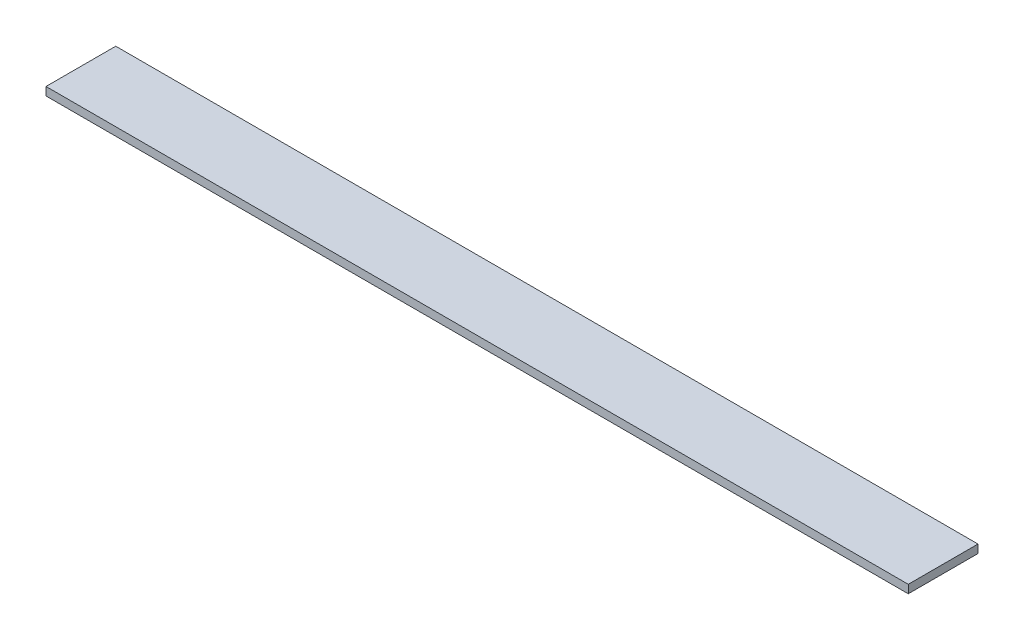
ISO-10303-21;
HEADER;
FILE_DESCRIPTION(('STEP AP214'),'2;1');
FILE_NAME('part.step','',(''),(''),'','','');
FILE_SCHEMA(('AUTOMOTIVE_DESIGN { 1 0 10303 214 1 1 1 1 }'));
ENDSEC;
DATA;
#1=APPLICATION_CONTEXT('core data for automotive mechanical design processes');
#2=APPLICATION_PROTOCOL_DEFINITION('international standard','automotive_design',2000,#1);
#3=PRODUCT_CONTEXT('',#1,'mechanical');
#4=PRODUCT('Part','Part','',(#3));
#5=PRODUCT_RELATED_PRODUCT_CATEGORY('part','',(#4));
#6=PRODUCT_DEFINITION_FORMATION('','',#4);
#7=PRODUCT_DEFINITION_CONTEXT('part definition',#1,'design');
#8=PRODUCT_DEFINITION('design','',#6,#7);
#9=PRODUCT_DEFINITION_SHAPE('','',#8);
#10=(LENGTH_UNIT() NAMED_UNIT(*) SI_UNIT(.MILLI.,.METRE.));
#11=(NAMED_UNIT(*) PLANE_ANGLE_UNIT() SI_UNIT($,.RADIAN.));
#12=(NAMED_UNIT(*) SI_UNIT($,.STERADIAN.) SOLID_ANGLE_UNIT());
#13=UNCERTAINTY_MEASURE_WITH_UNIT(LENGTH_MEASURE(1.E-05),#10,'distance_accuracy_value','');
#14=(GEOMETRIC_REPRESENTATION_CONTEXT(3) GLOBAL_UNCERTAINTY_ASSIGNED_CONTEXT((#13)) GLOBAL_UNIT_ASSIGNED_CONTEXT((#10,
#11,#12)) REPRESENTATION_CONTEXT('',''));
#15=CARTESIAN_POINT('',(0.,0.,0.));
#16=DIRECTION('',(0.,0.,1.));
#17=DIRECTION('',(1.,0.,0.));
#18=AXIS2_PLACEMENT_3D('',#15,#16,#17);
#19=CARTESIAN_POINT('',(-15.625,1.3,-7.5));
#20=DIRECTION('',(1.,0.,0.));
#21=DIRECTION('',(0.,0.,-1.));
#22=AXIS2_PLACEMENT_3D('',#19,#20,#21);
#23=PLANE('',#22);
#24=DIRECTION('',(0.,0.,1.));
#25=VECTOR('',#24,1.);
#26=CARTESIAN_POINT('',(-15.625,0.,-7.5));
#27=LINE('',#26,#25);
#28=CARTESIAN_POINT('',(-15.625,0.,-7.5));
#29=VERTEX_POINT('',#28);
#30=CARTESIAN_POINT('',(-15.625,0.,3.5));
#31=VERTEX_POINT('',#30);
#32=EDGE_CURVE('E93',#29,#31,#27,.T.);
#33=ORIENTED_EDGE('',*,*,#32,.T.);
#34=DIRECTION('',(0.,-1.,0.));
#35=VECTOR('',#34,1.);
#36=CARTESIAN_POINT('',(-15.625,1.3,3.5));
#37=LINE('',#36,#35);
#38=CARTESIAN_POINT('',(-15.625,1.3,3.5));
#39=VERTEX_POINT('',#38);
#40=EDGE_CURVE('E11',#39,#31,#37,.T.);
#41=ORIENTED_EDGE('',*,*,#40,.F.);
#42=DIRECTION('',(0.,0.,1.));
#43=VECTOR('',#42,1.);
#44=CARTESIAN_POINT('',(-15.625,1.3,-7.5));
#45=LINE('',#44,#43);
#46=CARTESIAN_POINT('',(-15.625,1.3,-7.5));
#47=VERTEX_POINT('',#46);
#48=EDGE_CURVE('E113',#47,#39,#45,.T.);
#49=ORIENTED_EDGE('',*,*,#48,.F.);
#50=DIRECTION('',(0.,-1.,0.));
#51=VECTOR('',#50,1.);
#52=CARTESIAN_POINT('',(-15.625,1.3,-7.5));
#53=LINE('',#52,#51);
#54=EDGE_CURVE('E52',#47,#29,#53,.T.);
#55=ORIENTED_EDGE('',*,*,#54,.T.);
#56=EDGE_LOOP('',(#33,#41,#49,#55));
#57=FACE_BOUND('',#56,.T.);
#58=ADVANCED_FACE('F43',(#57),#23,.F.);
#59=CARTESIAN_POINT('',(-15.625,1.3,3.5));
#60=DIRECTION('',(0.,0.,-1.));
#61=DIRECTION('',(-1.,0.,0.));
#62=AXIS2_PLACEMENT_3D('',#59,#60,#61);
#63=PLANE('',#62);
#64=DIRECTION('',(1.,0.,0.));
#65=VECTOR('',#64,1.);
#66=CARTESIAN_POINT('',(-15.625,0.,3.5));
#67=LINE('',#66,#65);
#68=CARTESIAN_POINT('',(120.375,0.,3.5));
#69=VERTEX_POINT('',#68);
#70=EDGE_CURVE('E72',#31,#69,#67,.T.);
#71=ORIENTED_EDGE('',*,*,#70,.T.);
#72=DIRECTION('',(0.,-1.,0.));
#73=VECTOR('',#72,1.);
#74=CARTESIAN_POINT('',(120.375,1.3,3.5));
#75=LINE('',#74,#73);
#76=CARTESIAN_POINT('',(120.375,1.3,3.5));
#77=VERTEX_POINT('',#76);
#78=EDGE_CURVE('E88',#77,#69,#75,.T.);
#79=ORIENTED_EDGE('',*,*,#78,.F.);
#80=DIRECTION('',(1.,0.,0.));
#81=VECTOR('',#80,1.);
#82=CARTESIAN_POINT('',(-15.625,1.3,3.5));
#83=LINE('',#82,#81);
#84=EDGE_CURVE('E76',#39,#77,#83,.T.);
#85=ORIENTED_EDGE('',*,*,#84,.F.);
#86=ORIENTED_EDGE('',*,*,#40,.T.);
#87=EDGE_LOOP('',(#71,#79,#85,#86));
#88=FACE_BOUND('',#87,.T.);
#89=ADVANCED_FACE('F86',(#88),#63,.F.);
#90=CARTESIAN_POINT('',(-15.625,1.3,-7.5));
#91=DIRECTION('',(0.,0.,1.));
#92=DIRECTION('',(1.,0.,0.));
#93=AXIS2_PLACEMENT_3D('',#90,#91,#92);
#94=PLANE('',#93);
#95=DIRECTION('',(-1.,0.,0.));
#96=VECTOR('',#95,1.);
#97=CARTESIAN_POINT('',(-15.625,0.,-7.5));
#98=LINE('',#97,#96);
#99=CARTESIAN_POINT('',(120.375,0.,-7.5));
#100=VERTEX_POINT('',#99);
#101=EDGE_CURVE('E92',#100,#29,#98,.T.);
#102=ORIENTED_EDGE('',*,*,#101,.T.);
#103=ORIENTED_EDGE('',*,*,#54,.F.);
#104=DIRECTION('',(-1.,0.,0.));
#105=VECTOR('',#104,1.);
#106=CARTESIAN_POINT('',(-15.625,1.3,-7.5));
#107=LINE('',#106,#105);
#108=CARTESIAN_POINT('',(120.375,1.3,-7.5));
#109=VERTEX_POINT('',#108);
#110=EDGE_CURVE('E60',#109,#47,#107,.T.);
#111=ORIENTED_EDGE('',*,*,#110,.F.);
#112=DIRECTION('',(0.,1.,0.));
#113=VECTOR('',#112,1.);
#114=CARTESIAN_POINT('',(120.375,1.3,-7.5));
#115=LINE('',#114,#113);
#116=EDGE_CURVE('E102',#100,#109,#115,.T.);
#117=ORIENTED_EDGE('',*,*,#116,.F.);
#118=EDGE_LOOP('',(#102,#103,#111,#117));
#119=FACE_BOUND('',#118,.T.);
#120=ADVANCED_FACE('F128',(#119),#94,.F.);
#121=CARTESIAN_POINT('',(0.,1.3,0.));
#122=DIRECTION('',(0.,1.,0.));
#123=DIRECTION('',(0.,0.,1.));
#124=AXIS2_PLACEMENT_3D('',#121,#122,#123);
#125=PLANE('',#124);
#126=ORIENTED_EDGE('',*,*,#48,.T.);
#127=ORIENTED_EDGE('',*,*,#84,.T.);
#128=DIRECTION('',(0.,0.,1.));
#129=VECTOR('',#128,1.);
#130=CARTESIAN_POINT('',(120.375,1.3,3.5));
#131=LINE('',#130,#129);
#132=EDGE_CURVE('E105',#109,#77,#131,.T.);
#133=ORIENTED_EDGE('',*,*,#132,.F.);
#134=ORIENTED_EDGE('',*,*,#110,.T.);
#135=EDGE_LOOP('',(#126,#127,#133,#134));
#136=FACE_BOUND('',#135,.T.);
#137=ADVANCED_FACE('F129',(#136),#125,.T.);
#138=CARTESIAN_POINT('',(0.,0.,0.));
#139=DIRECTION('',(0.,1.,0.));
#140=DIRECTION('',(0.,0.,1.));
#141=AXIS2_PLACEMENT_3D('',#138,#139,#140);
#142=PLANE('',#141);
#143=ORIENTED_EDGE('',*,*,#32,.F.);
#144=ORIENTED_EDGE('',*,*,#101,.F.);
#145=DIRECTION('',(0.,0.,-1.));
#146=VECTOR('',#145,1.);
#147=CARTESIAN_POINT('',(120.375,0.,3.5));
#148=LINE('',#147,#146);
#149=EDGE_CURVE('E96',#69,#100,#148,.T.);
#150=ORIENTED_EDGE('',*,*,#149,.F.);
#151=ORIENTED_EDGE('',*,*,#70,.F.);
#152=EDGE_LOOP('',(#143,#144,#150,#151));
#153=FACE_BOUND('',#152,.T.);
#154=ADVANCED_FACE('F97',(#153),#142,.F.);
#155=CARTESIAN_POINT('',(120.375,0.,0.));
#156=DIRECTION('',(1.,0.,0.));
#157=DIRECTION('',(0.,0.,-1.));
#158=AXIS2_PLACEMENT_3D('',#155,#156,#157);
#159=PLANE('',#158);
#160=ORIENTED_EDGE('',*,*,#78,.T.);
#161=ORIENTED_EDGE('',*,*,#149,.T.);
#162=ORIENTED_EDGE('',*,*,#116,.T.);
#163=ORIENTED_EDGE('',*,*,#132,.T.);
#164=EDGE_LOOP('',(#160,#161,#162,#163));
#165=FACE_BOUND('',#164,.T.);
#166=ADVANCED_FACE('F104',(#165),#159,.T.);
#167=CLOSED_SHELL('',(#58,#89,#120,#137,#154,#166));
#168=MANIFOLD_SOLID_BREP('B2',#167);
#169=ADVANCED_BREP_SHAPE_REPRESENTATION('',(#18,#168),#14);
#170=SHAPE_DEFINITION_REPRESENTATION(#9,#169);
ENDSEC;
END-ISO-10303-21;
